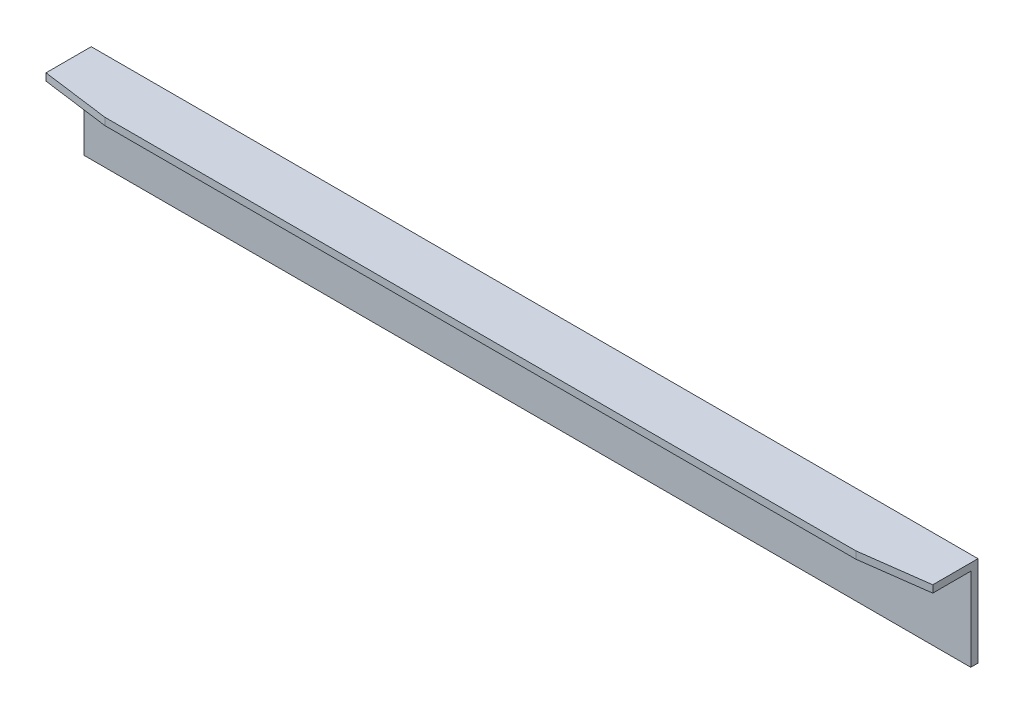
ISO-10303-21;
HEADER;
FILE_DESCRIPTION(('STEP AP214'),'2;1');
FILE_NAME('part.step','',(''),(''),'','','');
FILE_SCHEMA(('AUTOMOTIVE_DESIGN { 1 0 10303 214 1 1 1 1 }'));
ENDSEC;
DATA;
#1=APPLICATION_CONTEXT('core data for automotive mechanical design processes');
#2=APPLICATION_PROTOCOL_DEFINITION('international standard','automotive_design',2000,#1);
#3=PRODUCT_CONTEXT('',#1,'mechanical');
#4=PRODUCT('Part','Part','',(#3));
#5=PRODUCT_RELATED_PRODUCT_CATEGORY('part','',(#4));
#6=PRODUCT_DEFINITION_FORMATION('','',#4);
#7=PRODUCT_DEFINITION_CONTEXT('part definition',#1,'design');
#8=PRODUCT_DEFINITION('design','',#6,#7);
#9=PRODUCT_DEFINITION_SHAPE('','',#8);
#10=(LENGTH_UNIT() NAMED_UNIT(*) SI_UNIT(.MILLI.,.METRE.));
#11=(NAMED_UNIT(*) PLANE_ANGLE_UNIT() SI_UNIT($,.RADIAN.));
#12=(NAMED_UNIT(*) SI_UNIT($,.STERADIAN.) SOLID_ANGLE_UNIT());
#13=UNCERTAINTY_MEASURE_WITH_UNIT(LENGTH_MEASURE(1.E-05),#10,'distance_accuracy_value','');
#14=(GEOMETRIC_REPRESENTATION_CONTEXT(3) GLOBAL_UNCERTAINTY_ASSIGNED_CONTEXT((#13)) GLOBAL_UNIT_ASSIGNED_CONTEXT((#10,
#11,#12)) REPRESENTATION_CONTEXT('',''));
#15=CARTESIAN_POINT('',(0.,0.,0.));
#16=DIRECTION('',(0.,0.,1.));
#17=DIRECTION('',(1.,0.,0.));
#18=AXIS2_PLACEMENT_3D('',#15,#16,#17);
#19=CARTESIAN_POINT('',(-980.,200.,16.));
#20=DIRECTION('',(1.,0.,0.));
#21=DIRECTION('',(0.,0.,-1.));
#22=AXIS2_PLACEMENT_3D('',#19,#20,#21);
#23=PLANE('',#22);
#24=DIRECTION('',(0.,0.,-1.));
#25=VECTOR('',#24,1.);
#26=CARTESIAN_POINT('',(-980.,184.,120.));
#27=LINE('',#26,#25);
#28=CARTESIAN_POINT('',(-980.,184.,100.));
#29=VERTEX_POINT('',#28);
#30=CARTESIAN_POINT('',(-980.,184.,16.));
#31=VERTEX_POINT('',#30);
#32=EDGE_CURVE('E35',#29,#31,#27,.T.);
#33=ORIENTED_EDGE('',*,*,#32,.F.);
#34=DIRECTION('',(0.,1.,0.));
#35=VECTOR('',#34,1.);
#36=CARTESIAN_POINT('',(-980.,-2.49999998758188E-05,100.));
#37=LINE('',#36,#35);
#38=CARTESIAN_POINT('',(-980.,200.,100.));
#39=VERTEX_POINT('',#38);
#40=EDGE_CURVE('E109',#29,#39,#37,.T.);
#41=ORIENTED_EDGE('',*,*,#40,.T.);
#42=DIRECTION('',(0.,0.,-1.));
#43=VECTOR('',#42,1.);
#44=CARTESIAN_POINT('',(-980.,200.,16.));
#45=LINE('',#44,#43);
#46=CARTESIAN_POINT('',(-980.,200.,0.));
#47=VERTEX_POINT('',#46);
#48=EDGE_CURVE('E108',#39,#47,#45,.T.);
#49=ORIENTED_EDGE('',*,*,#48,.T.);
#50=DIRECTION('',(0.,-1.,0.));
#51=VECTOR('',#50,1.);
#52=CARTESIAN_POINT('',(-980.,200.,0.));
#53=LINE('',#52,#51);
#54=CARTESIAN_POINT('',(-980.,1.11022302462516E-13,0.));
#55=VERTEX_POINT('',#54);
#56=EDGE_CURVE('E172',#47,#55,#53,.T.);
#57=ORIENTED_EDGE('',*,*,#56,.T.);
#58=DIRECTION('',(0.,0.,-1.));
#59=VECTOR('',#58,1.);
#60=CARTESIAN_POINT('',(-980.,1.11022302462516E-13,16.));
#61=LINE('',#60,#59);
#62=CARTESIAN_POINT('',(-980.,1.11022302462516E-13,16.));
#63=VERTEX_POINT('',#62);
#64=EDGE_CURVE('E135',#63,#55,#61,.T.);
#65=ORIENTED_EDGE('',*,*,#64,.F.);
#66=DIRECTION('',(0.,-1.,0.));
#67=VECTOR('',#66,1.);
#68=CARTESIAN_POINT('',(-980.,200.,16.));
#69=LINE('',#68,#67);
#70=EDGE_CURVE('E148',#31,#63,#69,.T.);
#71=ORIENTED_EDGE('',*,*,#70,.F.);
#72=EDGE_LOOP('',(#33,#41,#49,#57,#65,#71));
#73=FACE_BOUND('',#72,.T.);
#74=ADVANCED_FACE('F32',(#73),#23,.F.);
#75=CARTESIAN_POINT('',(-980.,1.11022302462516E-13,16.));
#76=DIRECTION('',(0.,1.,0.));
#77=DIRECTION('',(0.,0.,1.));
#78=AXIS2_PLACEMENT_3D('',#75,#76,#77);
#79=PLANE('',#78);
#80=DIRECTION('',(1.,0.,0.));
#81=VECTOR('',#80,1.);
#82=CARTESIAN_POINT('',(-980.,1.11022302462516E-13,0.));
#83=LINE('',#82,#81);
#84=CARTESIAN_POINT('',(980.,1.11022302462516E-13,0.));
#85=VERTEX_POINT('',#84);
#86=EDGE_CURVE('E159',#55,#85,#83,.T.);
#87=ORIENTED_EDGE('',*,*,#86,.T.);
#88=DIRECTION('',(0.,0.,-1.));
#89=VECTOR('',#88,1.);
#90=CARTESIAN_POINT('',(980.,1.11022302462516E-13,16.));
#91=LINE('',#90,#89);
#92=CARTESIAN_POINT('',(980.,1.11022302462516E-13,16.));
#93=VERTEX_POINT('',#92);
#94=EDGE_CURVE('E138',#93,#85,#91,.T.);
#95=ORIENTED_EDGE('',*,*,#94,.F.);
#96=DIRECTION('',(1.,0.,0.));
#97=VECTOR('',#96,1.);
#98=CARTESIAN_POINT('',(-980.,1.11022302462516E-13,16.));
#99=LINE('',#98,#97);
#100=EDGE_CURVE('E149',#63,#93,#99,.T.);
#101=ORIENTED_EDGE('',*,*,#100,.F.);
#102=ORIENTED_EDGE('',*,*,#64,.T.);
#103=EDGE_LOOP('',(#87,#95,#101,#102));
#104=FACE_BOUND('',#103,.T.);
#105=ADVANCED_FACE('F183',(#104),#79,.F.);
#106=CARTESIAN_POINT('',(980.,200.,16.));
#107=DIRECTION('',(-1.,0.,0.));
#108=DIRECTION('',(0.,0.,1.));
#109=AXIS2_PLACEMENT_3D('',#106,#107,#108);
#110=PLANE('',#109);
#111=DIRECTION('',(0.,0.,-1.));
#112=VECTOR('',#111,1.);
#113=CARTESIAN_POINT('',(980.,200.,16.));
#114=LINE('',#113,#112);
#115=CARTESIAN_POINT('',(980.,200.,100.));
#116=VERTEX_POINT('',#115);
#117=CARTESIAN_POINT('',(980.,200.,0.));
#118=VERTEX_POINT('',#117);
#119=EDGE_CURVE('E145',#116,#118,#114,.T.);
#120=ORIENTED_EDGE('',*,*,#119,.F.);
#121=DIRECTION('',(0.,1.,0.));
#122=VECTOR('',#121,1.);
#123=CARTESIAN_POINT('',(980.,-2.49999998758188E-05,100.));
#124=LINE('',#123,#122);
#125=CARTESIAN_POINT('',(980.,184.,100.));
#126=VERTEX_POINT('',#125);
#127=EDGE_CURVE('E271',#126,#116,#124,.T.);
#128=ORIENTED_EDGE('',*,*,#127,.F.);
#129=DIRECTION('',(0.,0.,-1.));
#130=VECTOR('',#129,1.);
#131=CARTESIAN_POINT('',(980.,184.,120.));
#132=LINE('',#131,#130);
#133=CARTESIAN_POINT('',(980.,184.,16.));
#134=VERTEX_POINT('',#133);
#135=EDGE_CURVE('E112',#126,#134,#132,.T.);
#136=ORIENTED_EDGE('',*,*,#135,.T.);
#137=DIRECTION('',(0.,1.,0.));
#138=VECTOR('',#137,1.);
#139=CARTESIAN_POINT('',(980.,200.,16.));
#140=LINE('',#139,#138);
#141=EDGE_CURVE('E129',#93,#134,#140,.T.);
#142=ORIENTED_EDGE('',*,*,#141,.F.);
#143=ORIENTED_EDGE('',*,*,#94,.T.);
#144=DIRECTION('',(0.,1.,0.));
#145=VECTOR('',#144,1.);
#146=CARTESIAN_POINT('',(980.,200.,0.));
#147=LINE('',#146,#145);
#148=EDGE_CURVE('E154',#85,#118,#147,.T.);
#149=ORIENTED_EDGE('',*,*,#148,.T.);
#150=EDGE_LOOP('',(#120,#128,#136,#142,#143,#149));
#151=FACE_BOUND('',#150,.T.);
#152=ADVANCED_FACE('F167',(#151),#110,.F.);
#153=CARTESIAN_POINT('',(-980.,200.,16.));
#154=DIRECTION('',(0.,-1.,0.));
#155=DIRECTION('',(0.,0.,-1.));
#156=AXIS2_PLACEMENT_3D('',#153,#154,#155);
#157=PLANE('',#156);
#158=ORIENTED_EDGE('',*,*,#48,.F.);
#159=DIRECTION('',(-0.991227900682634,0.,-0.132163720091019));
#160=VECTOR('',#159,1.);
#161=CARTESIAN_POINT('',(-980.,200.,100.));
#162=LINE('',#161,#160);
#163=CARTESIAN_POINT('',(-830.,200.,120.));
#164=VERTEX_POINT('',#163);
#165=EDGE_CURVE('E97',#164,#39,#162,.T.);
#166=ORIENTED_EDGE('',*,*,#165,.F.);
#167=DIRECTION('',(-1.,0.,0.));
#168=VECTOR('',#167,1.);
#169=CARTESIAN_POINT('',(-980.,200.,120.));
#170=LINE('',#169,#168);
#171=CARTESIAN_POINT('',(830.,200.,120.));
#172=VERTEX_POINT('',#171);
#173=EDGE_CURVE('E106',#172,#164,#170,.T.);
#174=ORIENTED_EDGE('',*,*,#173,.F.);
#175=DIRECTION('',(-0.991227900682634,0.,0.132163720091019));
#176=VECTOR('',#175,1.);
#177=CARTESIAN_POINT('',(980.,200.,100.));
#178=LINE('',#177,#176);
#179=EDGE_CURVE('E55',#116,#172,#178,.T.);
#180=ORIENTED_EDGE('',*,*,#179,.F.);
#181=ORIENTED_EDGE('',*,*,#119,.T.);
#182=DIRECTION('',(-1.,0.,0.));
#183=VECTOR('',#182,1.);
#184=CARTESIAN_POINT('',(-980.,200.,0.));
#185=LINE('',#184,#183);
#186=EDGE_CURVE('E150',#118,#47,#185,.T.);
#187=ORIENTED_EDGE('',*,*,#186,.T.);
#188=EDGE_LOOP('',(#158,#166,#174,#180,#181,#187));
#189=FACE_BOUND('',#188,.T.);
#190=ADVANCED_FACE('F105',(#189),#157,.F.);
#191=CARTESIAN_POINT('',(-980.,1.11022302462516E-13,16.));
#192=DIRECTION('',(0.,0.,1.));
#193=DIRECTION('',(1.,0.,0.));
#194=AXIS2_PLACEMENT_3D('',#191,#192,#193);
#195=PLANE('',#194);
#196=DIRECTION('',(1.,0.,0.));
#197=VECTOR('',#196,1.);
#198=CARTESIAN_POINT('',(-980.,184.,16.));
#199=LINE('',#198,#197);
#200=EDGE_CURVE('E116',#31,#134,#199,.T.);
#201=ORIENTED_EDGE('',*,*,#200,.F.);
#202=ORIENTED_EDGE('',*,*,#70,.T.);
#203=ORIENTED_EDGE('',*,*,#100,.T.);
#204=ORIENTED_EDGE('',*,*,#141,.T.);
#205=EDGE_LOOP('',(#201,#202,#203,#204));
#206=FACE_BOUND('',#205,.T.);
#207=ADVANCED_FACE('F181',(#206),#195,.T.);
#208=CARTESIAN_POINT('',(-980.,1.11022302462516E-13,0.));
#209=DIRECTION('',(0.,0.,1.));
#210=DIRECTION('',(1.,0.,0.));
#211=AXIS2_PLACEMENT_3D('',#208,#209,#210);
#212=PLANE('',#211);
#213=ORIENTED_EDGE('',*,*,#56,.F.);
#214=ORIENTED_EDGE('',*,*,#186,.F.);
#215=ORIENTED_EDGE('',*,*,#148,.F.);
#216=ORIENTED_EDGE('',*,*,#86,.F.);
#217=EDGE_LOOP('',(#213,#214,#215,#216));
#218=FACE_BOUND('',#217,.T.);
#219=ADVANCED_FACE('F171',(#218),#212,.F.);
#220=CARTESIAN_POINT('',(-980.,184.,120.));
#221=DIRECTION('',(0.,1.,0.));
#222=DIRECTION('',(0.,0.,1.));
#223=AXIS2_PLACEMENT_3D('',#220,#221,#222);
#224=PLANE('',#223);
#225=DIRECTION('',(1.,0.,0.));
#226=VECTOR('',#225,1.);
#227=CARTESIAN_POINT('',(-980.,184.,120.));
#228=LINE('',#227,#226);
#229=CARTESIAN_POINT('',(-830.000000000002,184.,120.));
#230=VERTEX_POINT('',#229);
#231=CARTESIAN_POINT('',(830.,184.,120.));
#232=VERTEX_POINT('',#231);
#233=EDGE_CURVE('E113',#230,#232,#228,.T.);
#234=ORIENTED_EDGE('',*,*,#233,.F.);
#235=DIRECTION('',(-0.991227900682635,0.,-0.132163720091019));
#236=VECTOR('',#235,1.);
#237=CARTESIAN_POINT('',(-977.379912663755,184.,100.349344978166));
#238=LINE('',#237,#236);
#239=EDGE_CURVE('E47',#230,#29,#238,.T.);
#240=ORIENTED_EDGE('',*,*,#239,.T.);
#241=ORIENTED_EDGE('',*,*,#32,.T.);
#242=ORIENTED_EDGE('',*,*,#200,.T.);
#243=ORIENTED_EDGE('',*,*,#135,.F.);
#244=DIRECTION('',(-0.991227900682635,0.,0.132163720091019));
#245=VECTOR('',#244,1.);
#246=CARTESIAN_POINT('',(-948.384279475982,184.,357.117903930134));
#247=LINE('',#246,#245);
#248=EDGE_CURVE('E128',#126,#232,#247,.T.);
#249=ORIENTED_EDGE('',*,*,#248,.T.);
#250=EDGE_LOOP('',(#234,#240,#241,#242,#243,#249));
#251=FACE_BOUND('',#250,.T.);
#252=ADVANCED_FACE('F178',(#251),#224,.F.);
#253=CARTESIAN_POINT('',(-980.,184.,120.));
#254=DIRECTION('',(0.,0.,1.));
#255=DIRECTION('',(1.,0.,0.));
#256=AXIS2_PLACEMENT_3D('',#253,#254,#255);
#257=PLANE('',#256);
#258=DIRECTION('',(0.,1.,0.));
#259=VECTOR('',#258,1.);
#260=CARTESIAN_POINT('',(-830.000000000002,184.,120.));
#261=LINE('',#260,#259);
#262=EDGE_CURVE('E11',#230,#164,#261,.T.);
#263=ORIENTED_EDGE('',*,*,#262,.F.);
#264=ORIENTED_EDGE('',*,*,#233,.T.);
#265=DIRECTION('',(0.,-1.,0.));
#266=VECTOR('',#265,1.);
#267=CARTESIAN_POINT('',(830.000000000002,184.,120.));
#268=LINE('',#267,#266);
#269=EDGE_CURVE('E41',#172,#232,#268,.T.);
#270=ORIENTED_EDGE('',*,*,#269,.F.);
#271=ORIENTED_EDGE('',*,*,#173,.T.);
#272=EDGE_LOOP('',(#263,#264,#270,#271));
#273=FACE_BOUND('',#272,.T.);
#274=ADVANCED_FACE('F111',(#273),#257,.T.);
#275=CARTESIAN_POINT('',(980.,-2.49999998758188E-05,100.));
#276=DIRECTION('',(-0.132163720091019,0.,-0.991227900682634));
#277=DIRECTION('',(-0.991227900682635,0.,0.132163720091019));
#278=AXIS2_PLACEMENT_3D('',#275,#276,#277);
#279=PLANE('',#278);
#280=ORIENTED_EDGE('',*,*,#127,.T.);
#281=ORIENTED_EDGE('',*,*,#179,.T.);
#282=ORIENTED_EDGE('',*,*,#269,.T.);
#283=ORIENTED_EDGE('',*,*,#248,.F.);
#284=EDGE_LOOP('',(#280,#281,#282,#283));
#285=FACE_BOUND('',#284,.T.);
#286=ADVANCED_FACE('F202',(#285),#279,.F.);
#287=CARTESIAN_POINT('',(-980.,-2.49999998758188E-05,100.));
#288=DIRECTION('',(0.132163720091019,0.,-0.991227900682634));
#289=DIRECTION('',(-0.991227900682635,0.,-0.132163720091019));
#290=AXIS2_PLACEMENT_3D('',#287,#288,#289);
#291=PLANE('',#290);
#292=ORIENTED_EDGE('',*,*,#262,.T.);
#293=ORIENTED_EDGE('',*,*,#165,.T.);
#294=ORIENTED_EDGE('',*,*,#40,.F.);
#295=ORIENTED_EDGE('',*,*,#239,.F.);
#296=EDGE_LOOP('',(#292,#293,#294,#295));
#297=FACE_BOUND('',#296,.T.);
#298=ADVANCED_FACE('F96',(#297),#291,.F.);
#299=CLOSED_SHELL('',(#74,#105,#152,#190,#207,#219,#252,#274,#286,#298));
#300=MANIFOLD_SOLID_BREP('B2',#299);
#301=ADVANCED_BREP_SHAPE_REPRESENTATION('',(#18,#300),#14);
#302=SHAPE_DEFINITION_REPRESENTATION(#9,#301);
ENDSEC;
END-ISO-10303-21;
